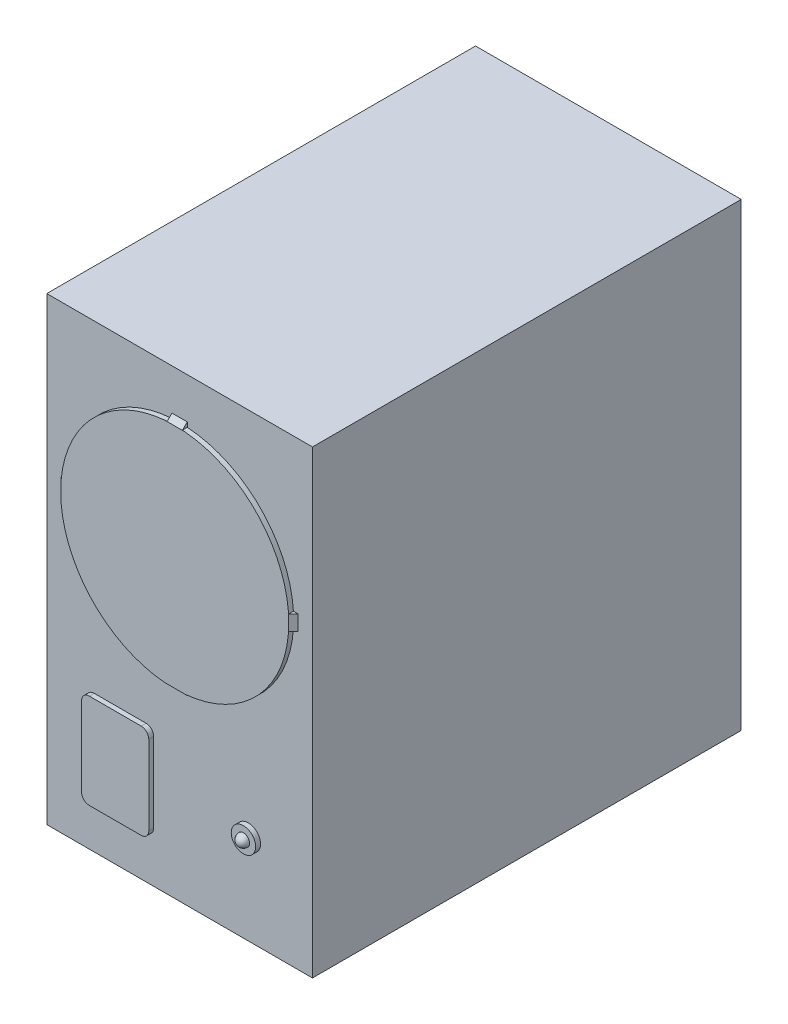
ISO-10303-21;
HEADER;
FILE_DESCRIPTION(('STEP AP214'),'2;1');
FILE_NAME('part.step','',(''),(''),'','','');
FILE_SCHEMA(('AUTOMOTIVE_DESIGN { 1 0 10303 214 1 1 1 1 }'));
ENDSEC;
DATA;
#1=APPLICATION_CONTEXT('core data for automotive mechanical design processes');
#2=APPLICATION_PROTOCOL_DEFINITION('international standard','automotive_design',2000,#1);
#3=PRODUCT_CONTEXT('',#1,'mechanical');
#4=PRODUCT('Part','Part','',(#3));
#5=PRODUCT_RELATED_PRODUCT_CATEGORY('part','',(#4));
#6=PRODUCT_DEFINITION_FORMATION('','',#4);
#7=PRODUCT_DEFINITION_CONTEXT('part definition',#1,'design');
#8=PRODUCT_DEFINITION('design','',#6,#7);
#9=PRODUCT_DEFINITION_SHAPE('','',#8);
#10=(LENGTH_UNIT() NAMED_UNIT(*) SI_UNIT(.MILLI.,.METRE.));
#11=(NAMED_UNIT(*) PLANE_ANGLE_UNIT() SI_UNIT($,.RADIAN.));
#12=(NAMED_UNIT(*) SI_UNIT($,.STERADIAN.) SOLID_ANGLE_UNIT());
#13=UNCERTAINTY_MEASURE_WITH_UNIT(LENGTH_MEASURE(1.E-05),#10,'distance_accuracy_value','');
#14=(GEOMETRIC_REPRESENTATION_CONTEXT(3) GLOBAL_UNCERTAINTY_ASSIGNED_CONTEXT((#13)) GLOBAL_UNIT_ASSIGNED_CONTEXT((#10,
#11,#12)) REPRESENTATION_CONTEXT('',''));
#15=CARTESIAN_POINT('',(0.,0.,0.));
#16=DIRECTION('',(0.,0.,1.));
#17=DIRECTION('',(1.,0.,0.));
#18=AXIS2_PLACEMENT_3D('',#15,#16,#17);
#19=CARTESIAN_POINT('',(-43.5,150.6,-70.2));
#20=DIRECTION('',(0.,0.,1.));
#21=DIRECTION('',(1.,0.,0.));
#22=AXIS2_PLACEMENT_3D('',#19,#20,#21);
#23=PLANE('',#22);
#24=CARTESIAN_POINT('',(0.,15.,-70.2));
#25=DIRECTION('',(0.,0.,-1.));
#26=DIRECTION('',(-1.,0.,0.));
#27=AXIS2_PLACEMENT_3D('',#24,#25,#26);
#28=CIRCLE('',#27,8.);
#29=CARTESIAN_POINT('',(-8.,15.,-70.2));
#30=VERTEX_POINT('',#29);
#31=CARTESIAN_POINT('',(8.,15.,-70.2));
#32=VERTEX_POINT('',#31);
#33=EDGE_CURVE('E64',#30,#32,#28,.T.);
#34=ORIENTED_EDGE('',*,*,#33,.F.);
#35=DIRECTION('',(0.,-1.,0.));
#36=VECTOR('',#35,1.);
#37=CARTESIAN_POINT('',(-8.,0.,-70.2));
#38=LINE('',#37,#36);
#39=CARTESIAN_POINT('',(-8.,0.,-70.2));
#40=VERTEX_POINT('',#39);
#41=EDGE_CURVE('E69',#30,#40,#38,.T.);
#42=ORIENTED_EDGE('',*,*,#41,.T.);
#43=DIRECTION('',(-1.,0.,0.));
#44=VECTOR('',#43,1.);
#45=CARTESIAN_POINT('',(-43.5,0.,-70.2));
#46=LINE('',#45,#44);
#47=CARTESIAN_POINT('',(-43.5,0.,-70.2));
#48=VERTEX_POINT('',#47);
#49=EDGE_CURVE('E511',#40,#48,#46,.T.);
#50=ORIENTED_EDGE('',*,*,#49,.T.);
#51=DIRECTION('',(0.,-1.,0.));
#52=VECTOR('',#51,1.);
#53=CARTESIAN_POINT('',(-43.5,150.6,-70.2));
#54=LINE('',#53,#52);
#55=CARTESIAN_POINT('',(-43.5,150.6,-70.2));
#56=VERTEX_POINT('',#55);
#57=EDGE_CURVE('E501',#56,#48,#54,.T.);
#58=ORIENTED_EDGE('',*,*,#57,.F.);
#59=DIRECTION('',(-1.,0.,0.));
#60=VECTOR('',#59,1.);
#61=CARTESIAN_POINT('',(-43.5,150.6,-70.2));
#62=LINE('',#61,#60);
#63=CARTESIAN_POINT('',(43.5,150.6,-70.2));
#64=VERTEX_POINT('',#63);
#65=EDGE_CURVE('E498',#64,#56,#62,.T.);
#66=ORIENTED_EDGE('',*,*,#65,.F.);
#67=DIRECTION('',(0.,-1.,0.));
#68=VECTOR('',#67,1.);
#69=CARTESIAN_POINT('',(43.5,150.6,-70.2));
#70=LINE('',#69,#68);
#71=CARTESIAN_POINT('',(43.5,0.,-70.2));
#72=VERTEX_POINT('',#71);
#73=EDGE_CURVE('E517',#64,#72,#70,.T.);
#74=ORIENTED_EDGE('',*,*,#73,.T.);
#75=CARTESIAN_POINT('',(8.,0.,-70.2));
#76=VERTEX_POINT('',#75);
#77=EDGE_CURVE('E492',#72,#76,#46,.T.);
#78=ORIENTED_EDGE('',*,*,#77,.T.);
#79=DIRECTION('',(0.,-1.,0.));
#80=VECTOR('',#79,1.);
#81=CARTESIAN_POINT('',(8.,0.,-70.2));
#82=LINE('',#81,#80);
#83=EDGE_CURVE('E280',#32,#76,#82,.T.);
#84=ORIENTED_EDGE('',*,*,#83,.F.);
#85=EDGE_LOOP('',(#34,#42,#50,#58,#66,#74,#78,#84));
#86=FACE_BOUND('',#85,.T.);
#87=ADVANCED_FACE('F47',(#86),#23,.F.);
#88=CARTESIAN_POINT('',(-43.5,150.6,70.2));
#89=DIRECTION('',(0.,0.,-1.));
#90=DIRECTION('',(-1.,0.,0.));
#91=AXIS2_PLACEMENT_3D('',#88,#89,#90);
#92=PLANE('',#91);
#93=CARTESIAN_POINT('',(22.5,29.5,70.2));
#94=DIRECTION('',(0.,0.,-1.));
#95=DIRECTION('',(-1.,0.,0.));
#96=AXIS2_PLACEMENT_3D('',#93,#94,#95);
#97=CIRCLE('',#96,4.);
#98=CARTESIAN_POINT('',(18.5,29.5,70.2));
#99=VERTEX_POINT('',#98);
#100=EDGE_CURVE('E529',#99,#99,#97,.F.);
#101=ORIENTED_EDGE('',*,*,#100,.F.);
#102=EDGE_LOOP('',(#101));
#103=FACE_BOUND('',#102,.T.);
#104=DIRECTION('',(1.,0.,0.));
#105=VECTOR('',#104,1.);
#106=CARTESIAN_POINT('',(0.,14.,70.2));
#107=LINE('',#106,#105);
#108=CARTESIAN_POINT('',(-28.,14.,70.2));
#109=VERTEX_POINT('',#108);
#110=CARTESIAN_POINT('',(-11.,14.,70.2));
#111=VERTEX_POINT('',#110);
#112=EDGE_CURVE('E343',#109,#111,#107,.T.);
#113=ORIENTED_EDGE('',*,*,#112,.F.);
#114=CARTESIAN_POINT('',(-28.,16.5,70.2));
#115=DIRECTION('',(0.,0.,1.));
#116=DIRECTION('',(1.,0.,0.));
#117=AXIS2_PLACEMENT_3D('',#114,#115,#116);
#118=CIRCLE('',#117,2.5);
#119=CARTESIAN_POINT('',(-30.5,16.5,70.2));
#120=VERTEX_POINT('',#119);
#121=EDGE_CURVE('E310',#109,#120,#118,.F.);
#122=ORIENTED_EDGE('',*,*,#121,.T.);
#123=DIRECTION('',(0.,-1.,0.));
#124=VECTOR('',#123,1.);
#125=CARTESIAN_POINT('',(-30.5,0.,70.2));
#126=LINE('',#125,#124);
#127=CARTESIAN_POINT('',(-30.5,42.5,70.2));
#128=VERTEX_POINT('',#127);
#129=EDGE_CURVE('E316',#128,#120,#126,.T.);
#130=ORIENTED_EDGE('',*,*,#129,.F.);
#131=CARTESIAN_POINT('',(-28.,42.5,70.2));
#132=DIRECTION('',(0.,0.,1.));
#133=DIRECTION('',(1.,0.,0.));
#134=AXIS2_PLACEMENT_3D('',#131,#132,#133);
#135=CIRCLE('',#134,2.5);
#136=CARTESIAN_POINT('',(-28.,45.,70.2));
#137=VERTEX_POINT('',#136);
#138=EDGE_CURVE('E360',#137,#128,#135,.T.);
#139=ORIENTED_EDGE('',*,*,#138,.F.);
#140=DIRECTION('',(1.,0.,0.));
#141=VECTOR('',#140,1.);
#142=CARTESIAN_POINT('',(0.,45.,70.2));
#143=LINE('',#142,#141);
#144=CARTESIAN_POINT('',(-11.,45.,70.2));
#145=VERTEX_POINT('',#144);
#146=EDGE_CURVE('E357',#137,#145,#143,.T.);
#147=ORIENTED_EDGE('',*,*,#146,.T.);
#148=CARTESIAN_POINT('',(-11.,42.5,70.2));
#149=DIRECTION('',(0.,0.,1.));
#150=DIRECTION('',(1.,0.,0.));
#151=AXIS2_PLACEMENT_3D('',#148,#149,#150);
#152=CIRCLE('',#151,2.5);
#153=CARTESIAN_POINT('',(-8.49999999999999,42.5,70.2));
#154=VERTEX_POINT('',#153);
#155=EDGE_CURVE('E354',#145,#154,#152,.F.);
#156=ORIENTED_EDGE('',*,*,#155,.T.);
#157=DIRECTION('',(0.,-1.,0.));
#158=VECTOR('',#157,1.);
#159=CARTESIAN_POINT('',(-8.49999999999999,0.,70.2));
#160=LINE('',#159,#158);
#161=CARTESIAN_POINT('',(-8.49999999999999,16.5,70.2));
#162=VERTEX_POINT('',#161);
#163=EDGE_CURVE('E351',#154,#162,#160,.T.);
#164=ORIENTED_EDGE('',*,*,#163,.T.);
#165=CARTESIAN_POINT('',(-11.,16.5,70.2));
#166=DIRECTION('',(0.,0.,1.));
#167=DIRECTION('',(1.,0.,0.));
#168=AXIS2_PLACEMENT_3D('',#165,#166,#167);
#169=CIRCLE('',#168,2.5);
#170=EDGE_CURVE('E347',#111,#162,#169,.T.);
#171=ORIENTED_EDGE('',*,*,#170,.F.);
#172=EDGE_LOOP('',(#113,#122,#130,#139,#147,#156,#164,#171));
#173=FACE_BOUND('',#172,.T.);
#174=DIRECTION('',(1.,0.,0.));
#175=VECTOR('',#174,1.);
#176=CARTESIAN_POINT('',(-43.5,0.,70.2));
#177=LINE('',#176,#175);
#178=CARTESIAN_POINT('',(-43.5,0.,70.2));
#179=VERTEX_POINT('',#178);
#180=CARTESIAN_POINT('',(43.5,0.,70.2));
#181=VERTEX_POINT('',#180);
#182=EDGE_CURVE('E505',#179,#181,#177,.T.);
#183=ORIENTED_EDGE('',*,*,#182,.T.);
#184=DIRECTION('',(0.,-1.,0.));
#185=VECTOR('',#184,1.);
#186=CARTESIAN_POINT('',(43.5,150.6,70.2));
#187=LINE('',#186,#185);
#188=CARTESIAN_POINT('',(43.5,150.6,70.2));
#189=VERTEX_POINT('',#188);
#190=EDGE_CURVE('E521',#189,#181,#187,.T.);
#191=ORIENTED_EDGE('',*,*,#190,.F.);
#192=DIRECTION('',(1.,0.,0.));
#193=VECTOR('',#192,1.);
#194=CARTESIAN_POINT('',(-43.5,150.6,70.2));
#195=LINE('',#194,#193);
#196=CARTESIAN_POINT('',(-43.5,150.6,70.2));
#197=VERTEX_POINT('',#196);
#198=EDGE_CURVE('E491',#197,#189,#195,.T.);
#199=ORIENTED_EDGE('',*,*,#198,.F.);
#200=DIRECTION('',(0.,-1.,0.));
#201=VECTOR('',#200,1.);
#202=CARTESIAN_POINT('',(-43.5,150.6,70.2));
#203=LINE('',#202,#201);
#204=EDGE_CURVE('E525',#197,#179,#203,.T.);
#205=ORIENTED_EDGE('',*,*,#204,.T.);
#206=EDGE_LOOP('',(#183,#191,#199,#205));
#207=FACE_BOUND('',#206,.T.);
#208=CARTESIAN_POINT('',(0.,98.4,70.2));
#209=DIRECTION('',(0.,0.,1.));
#210=DIRECTION('',(1.,0.,0.));
#211=AXIS2_PLACEMENT_3D('',#208,#209,#210);
#212=CIRCLE('',#211,37.35);
#213=CARTESIAN_POINT('',(-2.5,135.666238071477,70.2));
#214=VERTEX_POINT('',#213);
#215=CARTESIAN_POINT('',(-37.266238071477,100.9,70.2));
#216=VERTEX_POINT('',#215);
#217=EDGE_CURVE('E398',#214,#216,#212,.T.);
#218=ORIENTED_EDGE('',*,*,#217,.F.);
#219=DIRECTION('',(0.,-1.,0.));
#220=VECTOR('',#219,1.);
#221=CARTESIAN_POINT('',(-2.5,0.,70.2));
#222=LINE('',#221,#220);
#223=CARTESIAN_POINT('',(-2.5,137.2,70.2));
#224=VERTEX_POINT('',#223);
#225=EDGE_CURVE('E404',#224,#214,#222,.T.);
#226=ORIENTED_EDGE('',*,*,#225,.F.);
#227=DIRECTION('',(-1.,0.,0.));
#228=VECTOR('',#227,1.);
#229=CARTESIAN_POINT('',(-43.5,137.2,70.2));
#230=LINE('',#229,#228);
#231=CARTESIAN_POINT('',(2.5,137.2,70.2));
#232=VERTEX_POINT('',#231);
#233=EDGE_CURVE('E57',#224,#232,#230,.F.);
#234=ORIENTED_EDGE('',*,*,#233,.T.);
#235=DIRECTION('',(0.,-1.,0.));
#236=VECTOR('',#235,1.);
#237=CARTESIAN_POINT('',(2.49999999999995,0.,70.2));
#238=LINE('',#237,#236);
#239=CARTESIAN_POINT('',(2.5,135.666238071477,70.2));
#240=VERTEX_POINT('',#239);
#241=EDGE_CURVE('E452',#232,#240,#238,.T.);
#242=ORIENTED_EDGE('',*,*,#241,.T.);
#243=CARTESIAN_POINT('',(0.,98.4,70.2));
#244=DIRECTION('',(0.,0.,1.));
#245=DIRECTION('',(1.,0.,0.));
#246=AXIS2_PLACEMENT_3D('',#243,#244,#245);
#247=CIRCLE('',#246,37.35);
#248=CARTESIAN_POINT('',(37.266238071477,100.9,70.2));
#249=VERTEX_POINT('',#248);
#250=EDGE_CURVE('E448',#249,#240,#247,.T.);
#251=ORIENTED_EDGE('',*,*,#250,.F.);
#252=DIRECTION('',(-1.,0.,0.));
#253=VECTOR('',#252,1.);
#254=CARTESIAN_POINT('',(0.,100.9,70.2));
#255=LINE('',#254,#253);
#256=CARTESIAN_POINT('',(38.8,100.9,70.2));
#257=VERTEX_POINT('',#256);
#258=EDGE_CURVE('E445',#257,#249,#255,.T.);
#259=ORIENTED_EDGE('',*,*,#258,.F.);
#260=DIRECTION('',(0.,1.,0.));
#261=VECTOR('',#260,1.);
#262=CARTESIAN_POINT('',(38.8,150.6,70.2));
#263=LINE('',#262,#261);
#264=CARTESIAN_POINT('',(38.8,95.9,70.2));
#265=VERTEX_POINT('',#264);
#266=EDGE_CURVE('E11',#257,#265,#263,.F.);
#267=ORIENTED_EDGE('',*,*,#266,.T.);
#268=DIRECTION('',(-1.,0.,0.));
#269=VECTOR('',#268,1.);
#270=CARTESIAN_POINT('',(0.,95.9,70.2));
#271=LINE('',#270,#269);
#272=CARTESIAN_POINT('',(37.266238071477,95.9,70.2));
#273=VERTEX_POINT('',#272);
#274=EDGE_CURVE('E442',#265,#273,#271,.T.);
#275=ORIENTED_EDGE('',*,*,#274,.T.);
#276=CARTESIAN_POINT('',(0.,98.4,70.2));
#277=DIRECTION('',(0.,0.,1.));
#278=DIRECTION('',(1.,0.,0.));
#279=AXIS2_PLACEMENT_3D('',#276,#277,#278);
#280=CIRCLE('',#279,37.35);
#281=CARTESIAN_POINT('',(2.5,61.133761928523,70.2));
#282=VERTEX_POINT('',#281);
#283=EDGE_CURVE('E438',#282,#273,#280,.T.);
#284=ORIENTED_EDGE('',*,*,#283,.F.);
#285=DIRECTION('',(0.,1.,0.));
#286=VECTOR('',#285,1.);
#287=CARTESIAN_POINT('',(2.50000000000001,0.,70.2));
#288=LINE('',#287,#286);
#289=CARTESIAN_POINT('',(2.5,59.6,70.2));
#290=VERTEX_POINT('',#289);
#291=EDGE_CURVE('E435',#290,#282,#288,.T.);
#292=ORIENTED_EDGE('',*,*,#291,.F.);
#293=DIRECTION('',(-1.,0.,0.));
#294=VECTOR('',#293,1.);
#295=CARTESIAN_POINT('',(-43.5,59.6,70.2));
#296=LINE('',#295,#294);
#297=CARTESIAN_POINT('',(-2.49999999999998,59.6,70.2));
#298=VERTEX_POINT('',#297);
#299=EDGE_CURVE('E597',#290,#298,#296,.T.);
#300=ORIENTED_EDGE('',*,*,#299,.T.);
#301=DIRECTION('',(0.,1.,0.));
#302=VECTOR('',#301,1.);
#303=CARTESIAN_POINT('',(-2.49999999999997,0.,70.2));
#304=LINE('',#303,#302);
#305=CARTESIAN_POINT('',(-2.49999999999998,61.133761928523,70.2));
#306=VERTEX_POINT('',#305);
#307=EDGE_CURVE('E431',#298,#306,#304,.T.);
#308=ORIENTED_EDGE('',*,*,#307,.T.);
#309=CARTESIAN_POINT('',(0.,98.4,70.2));
#310=DIRECTION('',(0.,0.,1.));
#311=DIRECTION('',(1.,0.,0.));
#312=AXIS2_PLACEMENT_3D('',#309,#310,#311);
#313=CIRCLE('',#312,37.35);
#314=CARTESIAN_POINT('',(-37.266238071477,95.9,70.2));
#315=VERTEX_POINT('',#314);
#316=EDGE_CURVE('E427',#315,#306,#313,.T.);
#317=ORIENTED_EDGE('',*,*,#316,.F.);
#318=DIRECTION('',(1.,0.,0.));
#319=VECTOR('',#318,1.);
#320=CARTESIAN_POINT('',(0.,95.9,70.2));
#321=LINE('',#320,#319);
#322=CARTESIAN_POINT('',(-38.8,95.9,70.2));
#323=VERTEX_POINT('',#322);
#324=EDGE_CURVE('E424',#323,#315,#321,.T.);
#325=ORIENTED_EDGE('',*,*,#324,.F.);
#326=DIRECTION('',(0.,1.,0.));
#327=VECTOR('',#326,1.);
#328=CARTESIAN_POINT('',(-38.8,150.6,70.2));
#329=LINE('',#328,#327);
#330=CARTESIAN_POINT('',(-38.8,100.9,70.2));
#331=VERTEX_POINT('',#330);
#332=EDGE_CURVE('E600',#323,#331,#329,.T.);
#333=ORIENTED_EDGE('',*,*,#332,.T.);
#334=DIRECTION('',(1.,0.,0.));
#335=VECTOR('',#334,1.);
#336=CARTESIAN_POINT('',(0.,100.9,70.2));
#337=LINE('',#336,#335);
#338=EDGE_CURVE('E420',#331,#216,#337,.T.);
#339=ORIENTED_EDGE('',*,*,#338,.T.);
#340=EDGE_LOOP('',(#218,#226,#234,#242,#251,#259,#267,#275,#284,#292,#300,#308,#317,#325,#333,#339));
#341=FACE_BOUND('',#340,.T.);
#342=ADVANCED_FACE('F608',(#103,#173,#207,#341),#92,.F.);
#343=CARTESIAN_POINT('',(-43.5,150.6,-70.2));
#344=DIRECTION('',(1.,0.,0.));
#345=DIRECTION('',(0.,0.,-1.));
#346=AXIS2_PLACEMENT_3D('',#343,#344,#345);
#347=PLANE('',#346);
#348=DIRECTION('',(0.,0.,1.));
#349=VECTOR('',#348,1.);
#350=CARTESIAN_POINT('',(-43.5,0.,-70.2));
#351=LINE('',#350,#349);
#352=EDGE_CURVE('E486',#48,#179,#351,.T.);
#353=ORIENTED_EDGE('',*,*,#352,.T.);
#354=ORIENTED_EDGE('',*,*,#204,.F.);
#355=DIRECTION('',(0.,0.,1.));
#356=VECTOR('',#355,1.);
#357=CARTESIAN_POINT('',(-43.5,150.6,-70.2));
#358=LINE('',#357,#356);
#359=EDGE_CURVE('E487',#56,#197,#358,.T.);
#360=ORIENTED_EDGE('',*,*,#359,.F.);
#361=ORIENTED_EDGE('',*,*,#57,.T.);
#362=EDGE_LOOP('',(#353,#354,#360,#361));
#363=FACE_BOUND('',#362,.T.);
#364=ADVANCED_FACE('F694',(#363),#347,.F.);
#365=CARTESIAN_POINT('',(43.5,150.6,-70.2));
#366=DIRECTION('',(-1.,0.,0.));
#367=DIRECTION('',(0.,0.,1.));
#368=AXIS2_PLACEMENT_3D('',#365,#366,#367);
#369=PLANE('',#368);
#370=DIRECTION('',(0.,0.,-1.));
#371=VECTOR('',#370,1.);
#372=CARTESIAN_POINT('',(43.5,0.,-70.2));
#373=LINE('',#372,#371);
#374=EDGE_CURVE('E508',#181,#72,#373,.T.);
#375=ORIENTED_EDGE('',*,*,#374,.T.);
#376=ORIENTED_EDGE('',*,*,#73,.F.);
#377=DIRECTION('',(0.,0.,-1.));
#378=VECTOR('',#377,1.);
#379=CARTESIAN_POINT('',(43.5,150.6,-70.2));
#380=LINE('',#379,#378);
#381=EDGE_CURVE('E495',#189,#64,#380,.T.);
#382=ORIENTED_EDGE('',*,*,#381,.F.);
#383=ORIENTED_EDGE('',*,*,#190,.T.);
#384=EDGE_LOOP('',(#375,#376,#382,#383));
#385=FACE_BOUND('',#384,.T.);
#386=ADVANCED_FACE('F701',(#385),#369,.F.);
#387=CARTESIAN_POINT('',(0.,150.6,0.));
#388=DIRECTION('',(0.,1.,0.));
#389=DIRECTION('',(0.,0.,1.));
#390=AXIS2_PLACEMENT_3D('',#387,#388,#389);
#391=PLANE('',#390);
#392=ORIENTED_EDGE('',*,*,#359,.T.);
#393=ORIENTED_EDGE('',*,*,#198,.T.);
#394=ORIENTED_EDGE('',*,*,#381,.T.);
#395=ORIENTED_EDGE('',*,*,#65,.T.);
#396=EDGE_LOOP('',(#392,#393,#394,#395));
#397=FACE_BOUND('',#396,.T.);
#398=ADVANCED_FACE('F703',(#397),#391,.T.);
#399=CARTESIAN_POINT('',(0.,0.,0.));
#400=DIRECTION('',(0.,1.,0.));
#401=DIRECTION('',(0.,0.,1.));
#402=AXIS2_PLACEMENT_3D('',#399,#400,#401);
#403=PLANE('',#402);
#404=ORIENTED_EDGE('',*,*,#352,.F.);
#405=ORIENTED_EDGE('',*,*,#49,.F.);
#406=DIRECTION('',(0.,0.,1.));
#407=VECTOR('',#406,1.);
#408=CARTESIAN_POINT('',(-8.,0.,-75.2));
#409=LINE('',#408,#407);
#410=CARTESIAN_POINT('',(-8.,0.,-75.2));
#411=VERTEX_POINT('',#410);
#412=EDGE_CURVE('E290',#411,#40,#409,.T.);
#413=ORIENTED_EDGE('',*,*,#412,.F.);
#414=DIRECTION('',(-1.,0.,0.));
#415=VECTOR('',#414,1.);
#416=CARTESIAN_POINT('',(0.,0.,-75.2));
#417=LINE('',#416,#415);
#418=CARTESIAN_POINT('',(8.,0.,-75.2));
#419=VERTEX_POINT('',#418);
#420=EDGE_CURVE('E277',#419,#411,#417,.T.);
#421=ORIENTED_EDGE('',*,*,#420,.F.);
#422=DIRECTION('',(0.,0.,1.));
#423=VECTOR('',#422,1.);
#424=CARTESIAN_POINT('',(8.,0.,-75.2));
#425=LINE('',#424,#423);
#426=EDGE_CURVE('E297',#419,#76,#425,.T.);
#427=ORIENTED_EDGE('',*,*,#426,.T.);
#428=ORIENTED_EDGE('',*,*,#77,.F.);
#429=ORIENTED_EDGE('',*,*,#374,.F.);
#430=ORIENTED_EDGE('',*,*,#182,.F.);
#431=EDGE_LOOP('',(#404,#405,#413,#421,#427,#428,#429,#430));
#432=FACE_BOUND('',#431,.T.);
#433=ADVANCED_FACE('F699',(#432),#403,.F.);
#434=CARTESIAN_POINT('',(0.,98.4,71.8));
#435=DIRECTION('',(0.,0.,-1.));
#436=DIRECTION('',(-1.,0.,0.));
#437=AXIS2_PLACEMENT_3D('',#434,#435,#436);
#438=CYLINDRICAL_SURFACE('',#437,37.35);
#439=DIRECTION('',(0.,0.,-1.));
#440=VECTOR('',#439,1.);
#441=CARTESIAN_POINT('',(-37.266238071477,100.9,71.8));
#442=LINE('',#441,#440);
#443=CARTESIAN_POINT('',(-37.266238071477,100.9,71.733761928523));
#444=VERTEX_POINT('',#443);
#445=EDGE_CURVE('E483',#444,#216,#442,.T.);
#446=ORIENTED_EDGE('',*,*,#445,.F.);
#447=CARTESIAN_POINT('',(0.,98.4,109.));
#448=DIRECTION('',(-0.707106781186544,0.,0.707106781186551));
#449=DIRECTION('',(-0.707106781186551,0.,-0.707106781186544));
#450=AXIS2_PLACEMENT_3D('',#447,#448,#449);
#451=ELLIPSE('',#450,52.8208765546348,37.35);
#452=CARTESIAN_POINT('',(-37.2,101.744024521442,71.8));
#453=VERTEX_POINT('',#452);
#454=EDGE_CURVE('E576',#444,#453,#451,.F.);
#455=ORIENTED_EDGE('',*,*,#454,.T.);
#456=CARTESIAN_POINT('',(0.,98.4,71.8));
#457=DIRECTION('',(0.,0.,1.));
#458=DIRECTION('',(1.,0.,0.));
#459=AXIS2_PLACEMENT_3D('',#456,#457,#458);
#460=CIRCLE('',#459,37.35);
#461=CARTESIAN_POINT('',(-3.34402452144164,135.6,71.8));
#462=VERTEX_POINT('',#461);
#463=EDGE_CURVE('E399',#462,#453,#460,.T.);
#464=ORIENTED_EDGE('',*,*,#463,.F.);
#465=CARTESIAN_POINT('',(0.,98.4,109.));
#466=DIRECTION('',(0.,-0.707106781186549,-0.707106781186545));
#467=DIRECTION('',(0.,0.707106781186546,-0.70710678118655));
#468=AXIS2_PLACEMENT_3D('',#465,#466,#467);
#469=ELLIPSE('',#468,52.8208765546352,37.35);
#470=CARTESIAN_POINT('',(-2.5,135.666238071477,71.733761928523));
#471=VERTEX_POINT('',#470);
#472=EDGE_CURVE('E573',#462,#471,#469,.T.);
#473=ORIENTED_EDGE('',*,*,#472,.T.);
#474=DIRECTION('',(0.,0.,-1.));
#475=VECTOR('',#474,1.);
#476=CARTESIAN_POINT('',(-2.5,135.666238071477,71.8));
#477=LINE('',#476,#475);
#478=EDGE_CURVE('E416',#471,#214,#477,.T.);
#479=ORIENTED_EDGE('',*,*,#478,.T.);
#480=ORIENTED_EDGE('',*,*,#217,.T.);
#481=EDGE_LOOP('',(#446,#455,#464,#473,#479,#480));
#482=FACE_BOUND('',#481,.T.);
#483=ADVANCED_FACE('F676',(#482),#438,.T.);
#484=CARTESIAN_POINT('',(0.,100.9,71.8));
#485=DIRECTION('',(0.,1.,0.));
#486=DIRECTION('',(0.,0.,1.));
#487=AXIS2_PLACEMENT_3D('',#484,#485,#486);
#488=PLANE('',#487);
#489=ORIENTED_EDGE('',*,*,#338,.F.);
#490=DIRECTION('',(0.707106781186551,0.,0.707106781186544));
#491=VECTOR('',#490,1.);
#492=CARTESIAN_POINT('',(-18.5999999999998,100.9,90.4));
#493=LINE('',#492,#491);
#494=EDGE_CURVE('E570',#331,#444,#493,.T.);
#495=ORIENTED_EDGE('',*,*,#494,.T.);
#496=ORIENTED_EDGE('',*,*,#445,.T.);
#497=EDGE_LOOP('',(#489,#495,#496));
#498=FACE_BOUND('',#497,.T.);
#499=ADVANCED_FACE('F674',(#498),#488,.T.);
#500=CARTESIAN_POINT('',(0.,95.9,71.8));
#501=DIRECTION('',(0.,1.,0.));
#502=DIRECTION('',(0.,0.,1.));
#503=AXIS2_PLACEMENT_3D('',#500,#501,#502);
#504=PLANE('',#503);
#505=DIRECTION('',(0.,0.,-1.));
#506=VECTOR('',#505,1.);
#507=CARTESIAN_POINT('',(-37.266238071477,95.9,71.8));
#508=LINE('',#507,#506);
#509=CARTESIAN_POINT('',(-37.266238071477,95.9,71.733761928523));
#510=VERTEX_POINT('',#509);
#511=EDGE_CURVE('E479',#510,#315,#508,.T.);
#512=ORIENTED_EDGE('',*,*,#511,.F.);
#513=DIRECTION('',(-0.707106781186551,0.,-0.707106781186544));
#514=VECTOR('',#513,1.);
#515=CARTESIAN_POINT('',(-37.2,95.9,71.8));
#516=LINE('',#515,#514);
#517=EDGE_CURVE('E567',#510,#323,#516,.T.);
#518=ORIENTED_EDGE('',*,*,#517,.T.);
#519=ORIENTED_EDGE('',*,*,#324,.T.);
#520=EDGE_LOOP('',(#512,#518,#519));
#521=FACE_BOUND('',#520,.T.);
#522=ADVANCED_FACE('F826',(#521),#504,.F.);
#523=CARTESIAN_POINT('',(0.,98.4,71.8));
#524=DIRECTION('',(0.,0.,-1.));
#525=DIRECTION('',(-1.,0.,0.));
#526=AXIS2_PLACEMENT_3D('',#523,#524,#525);
#527=CYLINDRICAL_SURFACE('',#526,37.35);
#528=DIRECTION('',(0.,0.,-1.));
#529=VECTOR('',#528,1.);
#530=CARTESIAN_POINT('',(-2.49999999999998,61.133761928523,71.8));
#531=LINE('',#530,#529);
#532=CARTESIAN_POINT('',(-2.49999999999998,61.133761928523,71.733761928523));
#533=VERTEX_POINT('',#532);
#534=EDGE_CURVE('E476',#533,#306,#531,.T.);
#535=ORIENTED_EDGE('',*,*,#534,.F.);
#536=CARTESIAN_POINT('',(0.,98.4,109.));
#537=DIRECTION('',(0.,-0.707106781186544,0.707106781186551));
#538=DIRECTION('',(0.,-0.707106781186551,-0.707106781186544));
#539=AXIS2_PLACEMENT_3D('',#536,#537,#538);
#540=ELLIPSE('',#539,52.8208765546348,37.35);
#541=CARTESIAN_POINT('',(-3.3440245214418,61.2,71.8));
#542=VERTEX_POINT('',#541);
#543=EDGE_CURVE('E564',#533,#542,#540,.F.);
#544=ORIENTED_EDGE('',*,*,#543,.T.);
#545=CARTESIAN_POINT('',(0.,98.4,71.8));
#546=DIRECTION('',(0.,0.,1.));
#547=DIRECTION('',(1.,0.,0.));
#548=AXIS2_PLACEMENT_3D('',#545,#546,#547);
#549=CIRCLE('',#548,37.35);
#550=CARTESIAN_POINT('',(-37.2,95.0559754785584,71.8));
#551=VERTEX_POINT('',#550);
#552=EDGE_CURVE('E403',#551,#542,#549,.T.);
#553=ORIENTED_EDGE('',*,*,#552,.F.);
#554=CARTESIAN_POINT('',(0.,98.4,109.));
#555=DIRECTION('',(-0.707106781186544,0.,0.707106781186551));
#556=DIRECTION('',(-0.707106781186551,0.,-0.707106781186544));
#557=AXIS2_PLACEMENT_3D('',#554,#555,#556);
#558=ELLIPSE('',#557,52.8208765546348,37.35);
#559=EDGE_CURVE('E561',#551,#510,#558,.F.);
#560=ORIENTED_EDGE('',*,*,#559,.T.);
#561=ORIENTED_EDGE('',*,*,#511,.T.);
#562=ORIENTED_EDGE('',*,*,#316,.T.);
#563=EDGE_LOOP('',(#535,#544,#553,#560,#561,#562));
#564=FACE_BOUND('',#563,.T.);
#565=ADVANCED_FACE('F658',(#564),#527,.T.);
#566=CARTESIAN_POINT('',(-2.49999999999997,0.,71.8));
#567=DIRECTION('',(-1.,0.,0.));
#568=DIRECTION('',(0.,-1.,0.));
#569=AXIS2_PLACEMENT_3D('',#566,#567,#568);
#570=PLANE('',#569);
#571=ORIENTED_EDGE('',*,*,#307,.F.);
#572=DIRECTION('',(0.,0.707106781186551,0.707106781186544));
#573=VECTOR('',#572,1.);
#574=CARTESIAN_POINT('',(-2.49999999999998,30.5999999999997,41.2));
#575=LINE('',#574,#573);
#576=EDGE_CURVE('E558',#298,#533,#575,.T.);
#577=ORIENTED_EDGE('',*,*,#576,.T.);
#578=ORIENTED_EDGE('',*,*,#534,.T.);
#579=EDGE_LOOP('',(#571,#577,#578));
#580=FACE_BOUND('',#579,.T.);
#581=ADVANCED_FACE('F656',(#580),#570,.T.);
#582=CARTESIAN_POINT('',(2.50000000000001,0.,71.8));
#583=DIRECTION('',(-1.,0.,0.));
#584=DIRECTION('',(0.,-1.,0.));
#585=AXIS2_PLACEMENT_3D('',#582,#583,#584);
#586=PLANE('',#585);
#587=DIRECTION('',(0.,0.,-1.));
#588=VECTOR('',#587,1.);
#589=CARTESIAN_POINT('',(2.5,61.133761928523,71.8));
#590=LINE('',#589,#588);
#591=CARTESIAN_POINT('',(2.5,61.133761928523,71.733761928523));
#592=VERTEX_POINT('',#591);
#593=EDGE_CURVE('E472',#592,#282,#590,.T.);
#594=ORIENTED_EDGE('',*,*,#593,.F.);
#595=DIRECTION('',(0.,-0.707106781186551,-0.707106781186544));
#596=VECTOR('',#595,1.);
#597=CARTESIAN_POINT('',(2.5,61.2,71.8));
#598=LINE('',#597,#596);
#599=EDGE_CURVE('E555',#592,#290,#598,.T.);
#600=ORIENTED_EDGE('',*,*,#599,.T.);
#601=ORIENTED_EDGE('',*,*,#291,.T.);
#602=EDGE_LOOP('',(#594,#600,#601));
#603=FACE_BOUND('',#602,.T.);
#604=ADVANCED_FACE('F833',(#603),#586,.F.);
#605=CARTESIAN_POINT('',(0.,98.4,71.8));
#606=DIRECTION('',(0.,0.,-1.));
#607=DIRECTION('',(-1.,0.,0.));
#608=AXIS2_PLACEMENT_3D('',#605,#606,#607);
#609=CYLINDRICAL_SURFACE('',#608,37.35);
#610=CARTESIAN_POINT('',(0.,98.4,71.8));
#611=DIRECTION('',(0.,0.,1.));
#612=DIRECTION('',(1.,0.,0.));
#613=AXIS2_PLACEMENT_3D('',#610,#611,#612);
#614=CIRCLE('',#613,37.35);
#615=CARTESIAN_POINT('',(3.34402452144196,61.2,71.8));
#616=VERTEX_POINT('',#615);
#617=CARTESIAN_POINT('',(37.2,95.0559754785587,71.8));
#618=VERTEX_POINT('',#617);
#619=EDGE_CURVE('E408',#616,#618,#614,.T.);
#620=ORIENTED_EDGE('',*,*,#619,.F.);
#621=CARTESIAN_POINT('',(0.,98.4,109.));
#622=DIRECTION('',(0.,-0.707106781186544,0.707106781186551));
#623=DIRECTION('',(0.,-0.707106781186551,-0.707106781186544));
#624=AXIS2_PLACEMENT_3D('',#621,#622,#623);
#625=ELLIPSE('',#624,52.8208765546348,37.35);
#626=EDGE_CURVE('E552',#616,#592,#625,.F.);
#627=ORIENTED_EDGE('',*,*,#626,.T.);
#628=ORIENTED_EDGE('',*,*,#593,.T.);
#629=ORIENTED_EDGE('',*,*,#283,.T.);
#630=DIRECTION('',(0.,0.,-1.));
#631=VECTOR('',#630,1.);
#632=CARTESIAN_POINT('',(37.266238071477,95.9,71.8));
#633=LINE('',#632,#631);
#634=CARTESIAN_POINT('',(37.266238071477,95.9,71.733761928523));
#635=VERTEX_POINT('',#634);
#636=EDGE_CURVE('E468',#635,#273,#633,.T.);
#637=ORIENTED_EDGE('',*,*,#636,.F.);
#638=CARTESIAN_POINT('',(0.,98.4,109.));
#639=DIRECTION('',(-0.707106781186551,0.,-0.707106781186544));
#640=DIRECTION('',(0.707106781186544,0.,-0.707106781186551));
#641=AXIS2_PLACEMENT_3D('',#638,#639,#640);
#642=ELLIPSE('',#641,52.8208765546354,37.35);
#643=EDGE_CURVE('E549',#635,#618,#642,.T.);
#644=ORIENTED_EDGE('',*,*,#643,.T.);
#645=EDGE_LOOP('',(#620,#627,#628,#629,#637,#644));
#646=FACE_BOUND('',#645,.T.);
#647=ADVANCED_FACE('F641',(#646),#609,.T.);
#648=CARTESIAN_POINT('',(0.,95.9,71.8));
#649=DIRECTION('',(0.,-1.,0.));
#650=DIRECTION('',(0.,0.,-1.));
#651=AXIS2_PLACEMENT_3D('',#648,#649,#650);
#652=PLANE('',#651);
#653=ORIENTED_EDGE('',*,*,#274,.F.);
#654=DIRECTION('',(0.707106781186544,0.,-0.707106781186551));
#655=VECTOR('',#654,1.);
#656=CARTESIAN_POINT('',(18.6000000000002,95.9,90.4));
#657=LINE('',#656,#655);
#658=EDGE_CURVE('E591',#265,#635,#657,.F.);
#659=ORIENTED_EDGE('',*,*,#658,.T.);
#660=ORIENTED_EDGE('',*,*,#636,.T.);
#661=EDGE_LOOP('',(#653,#659,#660));
#662=FACE_BOUND('',#661,.T.);
#663=ADVANCED_FACE('F639',(#662),#652,.T.);
#664=CARTESIAN_POINT('',(0.,100.9,71.8));
#665=DIRECTION('',(0.,-1.,0.));
#666=DIRECTION('',(0.,0.,-1.));
#667=AXIS2_PLACEMENT_3D('',#664,#665,#666);
#668=PLANE('',#667);
#669=DIRECTION('',(0.,0.,-1.));
#670=VECTOR('',#669,1.);
#671=CARTESIAN_POINT('',(37.266238071477,100.9,71.8));
#672=LINE('',#671,#670);
#673=CARTESIAN_POINT('',(37.266238071477,100.9,71.733761928523));
#674=VERTEX_POINT('',#673);
#675=EDGE_CURVE('E464',#674,#249,#672,.T.);
#676=ORIENTED_EDGE('',*,*,#675,.F.);
#677=DIRECTION('',(-0.707106781186544,0.,0.707106781186551));
#678=VECTOR('',#677,1.);
#679=CARTESIAN_POINT('',(39.7,100.9,69.3));
#680=LINE('',#679,#678);
#681=EDGE_CURVE('E594',#674,#257,#680,.F.);
#682=ORIENTED_EDGE('',*,*,#681,.T.);
#683=ORIENTED_EDGE('',*,*,#258,.T.);
#684=EDGE_LOOP('',(#676,#682,#683));
#685=FACE_BOUND('',#684,.T.);
#686=ADVANCED_FACE('F634',(#685),#668,.F.);
#687=CARTESIAN_POINT('',(0.,98.4,71.8));
#688=DIRECTION('',(0.,0.,-1.));
#689=DIRECTION('',(-1.,0.,0.));
#690=AXIS2_PLACEMENT_3D('',#687,#688,#689);
#691=CYLINDRICAL_SURFACE('',#690,37.35);
#692=DIRECTION('',(0.,0.,-1.));
#693=VECTOR('',#692,1.);
#694=CARTESIAN_POINT('',(2.5,135.666238071477,71.8));
#695=LINE('',#694,#693);
#696=CARTESIAN_POINT('',(2.5,135.666238071477,71.733761928523));
#697=VERTEX_POINT('',#696);
#698=EDGE_CURVE('E461',#697,#240,#695,.T.);
#699=ORIENTED_EDGE('',*,*,#698,.F.);
#700=CARTESIAN_POINT('',(0.,98.4,109.));
#701=DIRECTION('',(0.,-0.707106781186549,-0.707106781186545));
#702=DIRECTION('',(0.,0.707106781186546,-0.70710678118655));
#703=AXIS2_PLACEMENT_3D('',#700,#701,#702);
#704=ELLIPSE('',#703,52.8208765546353,37.35);
#705=CARTESIAN_POINT('',(3.3440245214418,135.6,71.8));
#706=VERTEX_POINT('',#705);
#707=EDGE_CURVE('E585',#697,#706,#704,.T.);
#708=ORIENTED_EDGE('',*,*,#707,.T.);
#709=CARTESIAN_POINT('',(0.,98.4,71.8));
#710=DIRECTION('',(0.,0.,1.));
#711=DIRECTION('',(1.,0.,0.));
#712=AXIS2_PLACEMENT_3D('',#709,#710,#711);
#713=CIRCLE('',#712,37.35);
#714=CARTESIAN_POINT('',(37.2,101.744024521441,71.8));
#715=VERTEX_POINT('',#714);
#716=EDGE_CURVE('E412',#715,#706,#713,.T.);
#717=ORIENTED_EDGE('',*,*,#716,.F.);
#718=CARTESIAN_POINT('',(0.,98.4,109.));
#719=DIRECTION('',(-0.707106781186551,0.,-0.707106781186544));
#720=DIRECTION('',(0.707106781186544,0.,-0.707106781186551));
#721=AXIS2_PLACEMENT_3D('',#718,#719,#720);
#722=ELLIPSE('',#721,52.8208765546354,37.35);
#723=EDGE_CURVE('E582',#715,#674,#722,.T.);
#724=ORIENTED_EDGE('',*,*,#723,.T.);
#725=ORIENTED_EDGE('',*,*,#675,.T.);
#726=ORIENTED_EDGE('',*,*,#250,.T.);
#727=EDGE_LOOP('',(#699,#708,#717,#724,#725,#726));
#728=FACE_BOUND('',#727,.T.);
#729=ADVANCED_FACE('F621',(#728),#691,.T.);
#730=CARTESIAN_POINT('',(2.49999999999995,0.,71.8));
#731=DIRECTION('',(1.,0.,0.));
#732=DIRECTION('',(0.,1.,0.));
#733=AXIS2_PLACEMENT_3D('',#730,#731,#732);
#734=PLANE('',#733);
#735=ORIENTED_EDGE('',*,*,#241,.F.);
#736=DIRECTION('',(0.,0.707106781186546,-0.70710678118655));
#737=VECTOR('',#736,1.);
#738=CARTESIAN_POINT('',(2.49999999999998,67.8000000000004,139.6));
#739=LINE('',#738,#737);
#740=EDGE_CURVE('E579',#232,#697,#739,.F.);
#741=ORIENTED_EDGE('',*,*,#740,.T.);
#742=ORIENTED_EDGE('',*,*,#698,.T.);
#743=EDGE_LOOP('',(#735,#741,#742));
#744=FACE_BOUND('',#743,.T.);
#745=ADVANCED_FACE('F614',(#744),#734,.T.);
#746=CARTESIAN_POINT('',(-2.5,0.,71.8));
#747=DIRECTION('',(1.,0.,0.));
#748=DIRECTION('',(0.,0.,-1.));
#749=AXIS2_PLACEMENT_3D('',#746,#747,#748);
#750=PLANE('',#749);
#751=ORIENTED_EDGE('',*,*,#478,.F.);
#752=DIRECTION('',(0.,-0.707106781186546,0.70710678118655));
#753=VECTOR('',#752,1.);
#754=CARTESIAN_POINT('',(-2.5,138.1,69.3));
#755=LINE('',#754,#753);
#756=EDGE_CURVE('E588',#471,#224,#755,.F.);
#757=ORIENTED_EDGE('',*,*,#756,.T.);
#758=ORIENTED_EDGE('',*,*,#225,.T.);
#759=EDGE_LOOP('',(#751,#757,#758));
#760=FACE_BOUND('',#759,.T.);
#761=ADVANCED_FACE('F679',(#760),#750,.F.);
#762=CARTESIAN_POINT('',(0.,0.,71.8));
#763=DIRECTION('',(0.,0.,1.));
#764=DIRECTION('',(1.,0.,0.));
#765=AXIS2_PLACEMENT_3D('',#762,#763,#764);
#766=PLANE('',#765);
#767=ORIENTED_EDGE('',*,*,#552,.T.);
#768=DIRECTION('',(1.,0.,0.));
#769=VECTOR('',#768,1.);
#770=CARTESIAN_POINT('',(2.5,61.2,71.8));
#771=LINE('',#770,#769);
#772=EDGE_CURVE('E545',#542,#616,#771,.T.);
#773=ORIENTED_EDGE('',*,*,#772,.T.);
#774=ORIENTED_EDGE('',*,*,#619,.T.);
#775=DIRECTION('',(0.,1.,0.));
#776=VECTOR('',#775,1.);
#777=CARTESIAN_POINT('',(37.2,0.,71.8));
#778=LINE('',#777,#776);
#779=EDGE_CURVE('E533',#618,#715,#778,.T.);
#780=ORIENTED_EDGE('',*,*,#779,.T.);
#781=ORIENTED_EDGE('',*,*,#716,.T.);
#782=DIRECTION('',(-1.,0.,0.));
#783=VECTOR('',#782,1.);
#784=CARTESIAN_POINT('',(0.,135.6,71.8));
#785=LINE('',#784,#783);
#786=EDGE_CURVE('E537',#706,#462,#785,.T.);
#787=ORIENTED_EDGE('',*,*,#786,.T.);
#788=ORIENTED_EDGE('',*,*,#463,.T.);
#789=DIRECTION('',(0.,-1.,0.));
#790=VECTOR('',#789,1.);
#791=CARTESIAN_POINT('',(-37.2,95.9,71.8));
#792=LINE('',#791,#790);
#793=EDGE_CURVE('E541',#453,#551,#792,.T.);
#794=ORIENTED_EDGE('',*,*,#793,.T.);
#795=EDGE_LOOP('',(#767,#773,#774,#780,#781,#787,#788,#794));
#796=FACE_BOUND('',#795,.T.);
#797=ADVANCED_FACE('F623',(#796),#766,.T.);
#798=CARTESIAN_POINT('',(-28.,16.5,71.8));
#799=DIRECTION('',(0.,0.,-1.));
#800=DIRECTION('',(-1.,0.,0.));
#801=AXIS2_PLACEMENT_3D('',#798,#799,#800);
#802=CYLINDRICAL_SURFACE('',#801,2.5);
#803=ORIENTED_EDGE('',*,*,#121,.F.);
#804=DIRECTION('',(0.,0.,-1.));
#805=VECTOR('',#804,1.);
#806=CARTESIAN_POINT('',(-28.,14.,71.8));
#807=LINE('',#806,#805);
#808=CARTESIAN_POINT('',(-28.,14.,71.8));
#809=VERTEX_POINT('',#808);
#810=EDGE_CURVE('E394',#809,#109,#807,.T.);
#811=ORIENTED_EDGE('',*,*,#810,.F.);
#812=CARTESIAN_POINT('',(-28.,16.5,71.8));
#813=DIRECTION('',(0.,0.,1.));
#814=DIRECTION('',(1.,0.,0.));
#815=AXIS2_PLACEMENT_3D('',#812,#813,#814);
#816=CIRCLE('',#815,2.5);
#817=CARTESIAN_POINT('',(-30.5,16.5,71.8));
#818=VERTEX_POINT('',#817);
#819=EDGE_CURVE('E311',#809,#818,#816,.F.);
#820=ORIENTED_EDGE('',*,*,#819,.T.);
#821=DIRECTION('',(0.,0.,-1.));
#822=VECTOR('',#821,1.);
#823=CARTESIAN_POINT('',(-30.5,16.5,71.8));
#824=LINE('',#823,#822);
#825=EDGE_CURVE('E340',#818,#120,#824,.T.);
#826=ORIENTED_EDGE('',*,*,#825,.T.);
#827=EDGE_LOOP('',(#803,#811,#820,#826));
#828=FACE_BOUND('',#827,.T.);
#829=ADVANCED_FACE('F686',(#828),#802,.T.);
#830=CARTESIAN_POINT('',(0.,14.,71.8));
#831=DIRECTION('',(0.,1.,0.));
#832=DIRECTION('',(-1.,0.,0.));
#833=AXIS2_PLACEMENT_3D('',#830,#831,#832);
#834=PLANE('',#833);
#835=ORIENTED_EDGE('',*,*,#112,.T.);
#836=DIRECTION('',(0.,0.,-1.));
#837=VECTOR('',#836,1.);
#838=CARTESIAN_POINT('',(-11.,14.,71.8));
#839=LINE('',#838,#837);
#840=CARTESIAN_POINT('',(-11.,14.,71.8));
#841=VERTEX_POINT('',#840);
#842=EDGE_CURVE('E390',#841,#111,#839,.T.);
#843=ORIENTED_EDGE('',*,*,#842,.F.);
#844=DIRECTION('',(1.,0.,0.));
#845=VECTOR('',#844,1.);
#846=CARTESIAN_POINT('',(0.,14.,71.8));
#847=LINE('',#846,#845);
#848=EDGE_CURVE('E315',#809,#841,#847,.T.);
#849=ORIENTED_EDGE('',*,*,#848,.F.);
#850=ORIENTED_EDGE('',*,*,#810,.T.);
#851=EDGE_LOOP('',(#835,#843,#849,#850));
#852=FACE_BOUND('',#851,.T.);
#853=ADVANCED_FACE('F775',(#852),#834,.F.);
#854=CARTESIAN_POINT('',(-11.,16.5,71.8));
#855=DIRECTION('',(0.,0.,-1.));
#856=DIRECTION('',(-1.,0.,0.));
#857=AXIS2_PLACEMENT_3D('',#854,#855,#856);
#858=CYLINDRICAL_SURFACE('',#857,2.5);
#859=ORIENTED_EDGE('',*,*,#170,.T.);
#860=DIRECTION('',(0.,0.,-1.));
#861=VECTOR('',#860,1.);
#862=CARTESIAN_POINT('',(-8.49999999999999,16.5,71.8));
#863=LINE('',#862,#861);
#864=CARTESIAN_POINT('',(-8.49999999999999,16.5,71.8));
#865=VERTEX_POINT('',#864);
#866=EDGE_CURVE('E386',#865,#162,#863,.T.);
#867=ORIENTED_EDGE('',*,*,#866,.F.);
#868=CARTESIAN_POINT('',(-11.,16.5,71.8));
#869=DIRECTION('',(0.,0.,1.));
#870=DIRECTION('',(1.,0.,0.));
#871=AXIS2_PLACEMENT_3D('',#868,#869,#870);
#872=CIRCLE('',#871,2.5);
#873=EDGE_CURVE('E319',#841,#865,#872,.T.);
#874=ORIENTED_EDGE('',*,*,#873,.F.);
#875=ORIENTED_EDGE('',*,*,#842,.T.);
#876=EDGE_LOOP('',(#859,#867,#874,#875));
#877=FACE_BOUND('',#876,.T.);
#878=ADVANCED_FACE('F771',(#877),#858,.T.);
#879=CARTESIAN_POINT('',(-8.49999999999999,0.,71.8));
#880=DIRECTION('',(1.,0.,0.));
#881=DIRECTION('',(0.,1.,0.));
#882=AXIS2_PLACEMENT_3D('',#879,#880,#881);
#883=PLANE('',#882);
#884=ORIENTED_EDGE('',*,*,#163,.F.);
#885=DIRECTION('',(0.,0.,-1.));
#886=VECTOR('',#885,1.);
#887=CARTESIAN_POINT('',(-8.49999999999999,42.5,71.8));
#888=LINE('',#887,#886);
#889=CARTESIAN_POINT('',(-8.49999999999999,42.5,71.8));
#890=VERTEX_POINT('',#889);
#891=EDGE_CURVE('E382',#890,#154,#888,.T.);
#892=ORIENTED_EDGE('',*,*,#891,.F.);
#893=DIRECTION('',(0.,-1.,0.));
#894=VECTOR('',#893,1.);
#895=CARTESIAN_POINT('',(-8.49999999999999,0.,71.8));
#896=LINE('',#895,#894);
#897=EDGE_CURVE('E322',#890,#865,#896,.T.);
#898=ORIENTED_EDGE('',*,*,#897,.T.);
#899=ORIENTED_EDGE('',*,*,#866,.T.);
#900=EDGE_LOOP('',(#884,#892,#898,#899));
#901=FACE_BOUND('',#900,.T.);
#902=ADVANCED_FACE('F767',(#901),#883,.T.);
#903=CARTESIAN_POINT('',(-11.,42.5,71.8));
#904=DIRECTION('',(0.,0.,-1.));
#905=DIRECTION('',(-1.,0.,0.));
#906=AXIS2_PLACEMENT_3D('',#903,#904,#905);
#907=CYLINDRICAL_SURFACE('',#906,2.5);
#908=ORIENTED_EDGE('',*,*,#155,.F.);
#909=DIRECTION('',(0.,0.,-1.));
#910=VECTOR('',#909,1.);
#911=CARTESIAN_POINT('',(-11.,45.,71.8));
#912=LINE('',#911,#910);
#913=CARTESIAN_POINT('',(-11.,45.,71.8));
#914=VERTEX_POINT('',#913);
#915=EDGE_CURVE('E378',#914,#145,#912,.T.);
#916=ORIENTED_EDGE('',*,*,#915,.F.);
#917=CARTESIAN_POINT('',(-11.,42.5,71.8));
#918=DIRECTION('',(0.,0.,1.));
#919=DIRECTION('',(1.,0.,0.));
#920=AXIS2_PLACEMENT_3D('',#917,#918,#919);
#921=CIRCLE('',#920,2.5);
#922=EDGE_CURVE('E326',#914,#890,#921,.F.);
#923=ORIENTED_EDGE('',*,*,#922,.T.);
#924=ORIENTED_EDGE('',*,*,#891,.T.);
#925=EDGE_LOOP('',(#908,#916,#923,#924));
#926=FACE_BOUND('',#925,.T.);
#927=ADVANCED_FACE('F763',(#926),#907,.T.);
#928=CARTESIAN_POINT('',(0.,45.,71.8));
#929=DIRECTION('',(0.,1.,0.));
#930=DIRECTION('',(-1.,0.,0.));
#931=AXIS2_PLACEMENT_3D('',#928,#929,#930);
#932=PLANE('',#931);
#933=ORIENTED_EDGE('',*,*,#146,.F.);
#934=DIRECTION('',(0.,0.,-1.));
#935=VECTOR('',#934,1.);
#936=CARTESIAN_POINT('',(-28.,45.,71.8));
#937=LINE('',#936,#935);
#938=CARTESIAN_POINT('',(-28.,45.,71.8));
#939=VERTEX_POINT('',#938);
#940=EDGE_CURVE('E374',#939,#137,#937,.T.);
#941=ORIENTED_EDGE('',*,*,#940,.F.);
#942=DIRECTION('',(1.,0.,0.));
#943=VECTOR('',#942,1.);
#944=CARTESIAN_POINT('',(0.,45.,71.8));
#945=LINE('',#944,#943);
#946=EDGE_CURVE('E330',#939,#914,#945,.T.);
#947=ORIENTED_EDGE('',*,*,#946,.T.);
#948=ORIENTED_EDGE('',*,*,#915,.T.);
#949=EDGE_LOOP('',(#933,#941,#947,#948));
#950=FACE_BOUND('',#949,.T.);
#951=ADVANCED_FACE('F759',(#950),#932,.T.);
#952=CARTESIAN_POINT('',(-28.,42.5,71.8));
#953=DIRECTION('',(0.,0.,-1.));
#954=DIRECTION('',(-1.,0.,0.));
#955=AXIS2_PLACEMENT_3D('',#952,#953,#954);
#956=CYLINDRICAL_SURFACE('',#955,2.5);
#957=ORIENTED_EDGE('',*,*,#138,.T.);
#958=DIRECTION('',(0.,0.,-1.));
#959=VECTOR('',#958,1.);
#960=CARTESIAN_POINT('',(-30.5,42.5,71.8));
#961=LINE('',#960,#959);
#962=CARTESIAN_POINT('',(-30.5,42.5,71.8));
#963=VERTEX_POINT('',#962);
#964=EDGE_CURVE('E370',#963,#128,#961,.T.);
#965=ORIENTED_EDGE('',*,*,#964,.F.);
#966=CARTESIAN_POINT('',(-28.,42.5,71.8));
#967=DIRECTION('',(0.,0.,1.));
#968=DIRECTION('',(1.,0.,0.));
#969=AXIS2_PLACEMENT_3D('',#966,#967,#968);
#970=CIRCLE('',#969,2.5);
#971=EDGE_CURVE('E334',#939,#963,#970,.T.);
#972=ORIENTED_EDGE('',*,*,#971,.F.);
#973=ORIENTED_EDGE('',*,*,#940,.T.);
#974=EDGE_LOOP('',(#957,#965,#972,#973));
#975=FACE_BOUND('',#974,.T.);
#976=ADVANCED_FACE('F755',(#975),#956,.T.);
#977=CARTESIAN_POINT('',(-30.5,0.,71.8));
#978=DIRECTION('',(1.,0.,0.));
#979=DIRECTION('',(0.,1.,0.));
#980=AXIS2_PLACEMENT_3D('',#977,#978,#979);
#981=PLANE('',#980);
#982=ORIENTED_EDGE('',*,*,#129,.T.);
#983=ORIENTED_EDGE('',*,*,#825,.F.);
#984=DIRECTION('',(0.,-1.,0.));
#985=VECTOR('',#984,1.);
#986=CARTESIAN_POINT('',(-30.5,0.,71.8));
#987=LINE('',#986,#985);
#988=EDGE_CURVE('E337',#963,#818,#987,.T.);
#989=ORIENTED_EDGE('',*,*,#988,.F.);
#990=ORIENTED_EDGE('',*,*,#964,.T.);
#991=EDGE_LOOP('',(#982,#983,#989,#990));
#992=FACE_BOUND('',#991,.T.);
#993=ADVANCED_FACE('F751',(#992),#981,.F.);
#994=CARTESIAN_POINT('',(0.,0.,71.8));
#995=DIRECTION('',(0.,0.,1.));
#996=DIRECTION('',(1.,0.,0.));
#997=AXIS2_PLACEMENT_3D('',#994,#995,#996);
#998=PLANE('',#997);
#999=ORIENTED_EDGE('',*,*,#819,.F.);
#1000=ORIENTED_EDGE('',*,*,#848,.T.);
#1001=ORIENTED_EDGE('',*,*,#873,.T.);
#1002=ORIENTED_EDGE('',*,*,#897,.F.);
#1003=ORIENTED_EDGE('',*,*,#922,.F.);
#1004=ORIENTED_EDGE('',*,*,#946,.F.);
#1005=ORIENTED_EDGE('',*,*,#971,.T.);
#1006=ORIENTED_EDGE('',*,*,#988,.T.);
#1007=EDGE_LOOP('',(#999,#1000,#1001,#1002,#1003,#1004,#1005,#1006));
#1008=FACE_BOUND('',#1007,.T.);
#1009=ADVANCED_FACE('F747',(#1008),#998,.T.);
#1010=CARTESIAN_POINT('',(22.5,29.5,71.8));
#1011=DIRECTION('',(0.,0.,-1.));
#1012=DIRECTION('',(-1.,0.,0.));
#1013=AXIS2_PLACEMENT_3D('',#1010,#1011,#1012);
#1014=CYLINDRICAL_SURFACE('',#1013,4.);
#1015=CARTESIAN_POINT('',(22.5,29.5,71.8));
#1016=DIRECTION('',(0.,0.,1.));
#1017=DIRECTION('',(1.,0.,0.));
#1018=AXIS2_PLACEMENT_3D('',#1015,#1016,#1017);
#1019=CIRCLE('',#1018,4.);
#1020=CARTESIAN_POINT('',(26.5,29.5,71.8));
#1021=VERTEX_POINT('',#1020);
#1022=EDGE_CURVE('E306',#1021,#1021,#1019,.T.);
#1023=ORIENTED_EDGE('',*,*,#1022,.F.);
#1024=EDGE_LOOP('',(#1023));
#1025=FACE_BOUND('',#1024,.T.);
#1026=ORIENTED_EDGE('',*,*,#100,.T.);
#1027=EDGE_LOOP('',(#1026));
#1028=FACE_BOUND('',#1027,.T.);
#1029=ADVANCED_FACE('F743',(#1025,#1028),#1014,.T.);
#1030=CARTESIAN_POINT('',(0.,0.,71.8));
#1031=DIRECTION('',(0.,0.,1.));
#1032=DIRECTION('',(1.,0.,0.));
#1033=AXIS2_PLACEMENT_3D('',#1030,#1031,#1032);
#1034=PLANE('',#1033);
#1035=CARTESIAN_POINT('',(22.5,29.5,71.8));
#1036=DIRECTION('',(0.,0.,-1.));
#1037=DIRECTION('',(1.,0.,0.));
#1038=AXIS2_PLACEMENT_3D('',#1035,#1036,#1037);
#1039=CIRCLE('',#1038,2.);
#1040=CARTESIAN_POINT('',(24.5,29.5,71.8));
#1041=VERTEX_POINT('',#1040);
#1042=EDGE_CURVE('E263',#1041,#1041,#1039,.T.);
#1043=ORIENTED_EDGE('',*,*,#1042,.T.);
#1044=EDGE_LOOP('',(#1043));
#1045=FACE_BOUND('',#1044,.T.);
#1046=ORIENTED_EDGE('',*,*,#1022,.T.);
#1047=EDGE_LOOP('',(#1046));
#1048=FACE_BOUND('',#1047,.T.);
#1049=ADVANCED_FACE('F739',(#1045,#1048),#1034,.T.);
#1050=CARTESIAN_POINT('',(22.5,29.5,71.8));
#1051=DIRECTION('',(-1.,0.,0.));
#1052=DIRECTION('',(0.,-1.,0.));
#1053=AXIS2_PLACEMENT_3D('',#1050,#1051,#1052);
#1054=SPHERICAL_SURFACE('',#1053,2.);
#1055=CARTESIAN_POINT('',(22.5,29.5,71.8));
#1056=DIRECTION('',(0.,0.,-1.));
#1057=DIRECTION('',(1.,0.,0.));
#1058=AXIS2_PLACEMENT_3D('',#1055,#1056,#1057);
#1059=SPHERICAL_SURFACE('',#1058,2.);
#1060=ORIENTED_EDGE('',*,*,#1042,.F.);
#1061=EDGE_LOOP('',(#1060));
#1062=FACE_BOUND('',#1061,.T.);
#1063=ADVANCED_FACE('F715',(#1062),#1059,.T.);
#1064=CARTESIAN_POINT('',(0.,61.2,71.8));
#1065=DIRECTION('',(0.,-0.707106781186544,0.707106781186551));
#1066=DIRECTION('',(-1.,0.,0.));
#1067=AXIS2_PLACEMENT_3D('',#1064,#1065,#1066);
#1068=PLANE('',#1067);
#1069=ORIENTED_EDGE('',*,*,#576,.F.);
#1070=ORIENTED_EDGE('',*,*,#299,.F.);
#1071=ORIENTED_EDGE('',*,*,#599,.F.);
#1072=ORIENTED_EDGE('',*,*,#626,.F.);
#1073=ORIENTED_EDGE('',*,*,#772,.F.);
#1074=ORIENTED_EDGE('',*,*,#543,.F.);
#1075=EDGE_LOOP('',(#1069,#1070,#1071,#1072,#1073,#1074));
#1076=FACE_BOUND('',#1075,.T.);
#1077=ADVANCED_FACE('F651',(#1076),#1068,.T.);
#1078=CARTESIAN_POINT('',(-37.2,0.,71.8));
#1079=DIRECTION('',(-0.707106781186544,0.,0.707106781186551));
#1080=DIRECTION('',(0.,1.,0.));
#1081=AXIS2_PLACEMENT_3D('',#1078,#1079,#1080);
#1082=PLANE('',#1081);
#1083=ORIENTED_EDGE('',*,*,#494,.F.);
#1084=ORIENTED_EDGE('',*,*,#332,.F.);
#1085=ORIENTED_EDGE('',*,*,#517,.F.);
#1086=ORIENTED_EDGE('',*,*,#559,.F.);
#1087=ORIENTED_EDGE('',*,*,#793,.F.);
#1088=ORIENTED_EDGE('',*,*,#454,.F.);
#1089=EDGE_LOOP('',(#1083,#1084,#1085,#1086,#1087,#1088));
#1090=FACE_BOUND('',#1089,.T.);
#1091=ADVANCED_FACE('F669',(#1090),#1082,.T.);
#1092=CARTESIAN_POINT('',(0.,138.1,69.3));
#1093=DIRECTION('',(0.,-0.707106781186549,-0.707106781186545));
#1094=DIRECTION('',(1.,0.,0.));
#1095=AXIS2_PLACEMENT_3D('',#1092,#1093,#1094);
#1096=PLANE('',#1095);
#1097=ORIENTED_EDGE('',*,*,#472,.F.);
#1098=ORIENTED_EDGE('',*,*,#786,.F.);
#1099=ORIENTED_EDGE('',*,*,#707,.F.);
#1100=ORIENTED_EDGE('',*,*,#740,.F.);
#1101=ORIENTED_EDGE('',*,*,#233,.F.);
#1102=ORIENTED_EDGE('',*,*,#756,.F.);
#1103=EDGE_LOOP('',(#1097,#1098,#1099,#1100,#1101,#1102));
#1104=FACE_BOUND('',#1103,.T.);
#1105=ADVANCED_FACE('F617',(#1104),#1096,.F.);
#1106=CARTESIAN_POINT('',(39.7,0.,69.3));
#1107=DIRECTION('',(-0.707106781186551,0.,-0.707106781186544));
#1108=DIRECTION('',(0.,-1.,0.));
#1109=AXIS2_PLACEMENT_3D('',#1106,#1107,#1108);
#1110=PLANE('',#1109);
#1111=ORIENTED_EDGE('',*,*,#723,.F.);
#1112=ORIENTED_EDGE('',*,*,#779,.F.);
#1113=ORIENTED_EDGE('',*,*,#643,.F.);
#1114=ORIENTED_EDGE('',*,*,#658,.F.);
#1115=ORIENTED_EDGE('',*,*,#266,.F.);
#1116=ORIENTED_EDGE('',*,*,#681,.F.);
#1117=EDGE_LOOP('',(#1111,#1112,#1113,#1114,#1115,#1116));
#1118=FACE_BOUND('',#1117,.T.);
#1119=ADVANCED_FACE('F50',(#1118),#1110,.F.);
#1120=CARTESIAN_POINT('',(-8.,0.,-75.2));
#1121=DIRECTION('',(-1.,0.,0.));
#1122=DIRECTION('',(0.,-1.,0.));
#1123=AXIS2_PLACEMENT_3D('',#1120,#1121,#1122);
#1124=PLANE('',#1123);
#1125=ORIENTED_EDGE('',*,*,#41,.F.);
#1126=DIRECTION('',(0.,0.,1.));
#1127=VECTOR('',#1126,1.);
#1128=CARTESIAN_POINT('',(-8.,15.,-75.2));
#1129=LINE('',#1128,#1127);
#1130=CARTESIAN_POINT('',(-8.,15.,-75.2));
#1131=VERTEX_POINT('',#1130);
#1132=EDGE_CURVE('E255',#1131,#30,#1129,.T.);
#1133=ORIENTED_EDGE('',*,*,#1132,.F.);
#1134=DIRECTION('',(0.,-1.,0.));
#1135=VECTOR('',#1134,1.);
#1136=CARTESIAN_POINT('',(-8.,0.,-75.2));
#1137=LINE('',#1136,#1135);
#1138=EDGE_CURVE('E260',#1131,#411,#1137,.T.);
#1139=ORIENTED_EDGE('',*,*,#1138,.T.);
#1140=ORIENTED_EDGE('',*,*,#412,.T.);
#1141=EDGE_LOOP('',(#1125,#1133,#1139,#1140));
#1142=FACE_BOUND('',#1141,.T.);
#1143=ADVANCED_FACE('F257',(#1142),#1124,.T.);
#1144=CARTESIAN_POINT('',(0.,15.,-75.2));
#1145=DIRECTION('',(0.,0.,1.));
#1146=DIRECTION('',(1.,0.,0.));
#1147=AXIS2_PLACEMENT_3D('',#1144,#1145,#1146);
#1148=CYLINDRICAL_SURFACE('',#1147,8.);
#1149=ORIENTED_EDGE('',*,*,#33,.T.);
#1150=DIRECTION('',(0.,0.,1.));
#1151=VECTOR('',#1150,1.);
#1152=CARTESIAN_POINT('',(8.,15.,-75.2));
#1153=LINE('',#1152,#1151);
#1154=CARTESIAN_POINT('',(8.,15.,-75.2));
#1155=VERTEX_POINT('',#1154);
#1156=EDGE_CURVE('E264',#1155,#32,#1153,.T.);
#1157=ORIENTED_EDGE('',*,*,#1156,.F.);
#1158=CARTESIAN_POINT('',(0.,15.,-75.2));
#1159=DIRECTION('',(0.,0.,-1.));
#1160=DIRECTION('',(-1.,0.,0.));
#1161=AXIS2_PLACEMENT_3D('',#1158,#1159,#1160);
#1162=CIRCLE('',#1161,8.);
#1163=EDGE_CURVE('E267',#1131,#1155,#1162,.T.);
#1164=ORIENTED_EDGE('',*,*,#1163,.F.);
#1165=ORIENTED_EDGE('',*,*,#1132,.T.);
#1166=EDGE_LOOP('',(#1149,#1157,#1164,#1165));
#1167=FACE_BOUND('',#1166,.T.);
#1168=ADVANCED_FACE('F268',(#1167),#1148,.T.);
#1169=CARTESIAN_POINT('',(8.,0.,-75.2));
#1170=DIRECTION('',(-1.,0.,0.));
#1171=DIRECTION('',(0.,-1.,0.));
#1172=AXIS2_PLACEMENT_3D('',#1169,#1170,#1171);
#1173=PLANE('',#1172);
#1174=ORIENTED_EDGE('',*,*,#83,.T.);
#1175=ORIENTED_EDGE('',*,*,#426,.F.);
#1176=DIRECTION('',(0.,-1.,0.));
#1177=VECTOR('',#1176,1.);
#1178=CARTESIAN_POINT('',(8.,0.,-75.2));
#1179=LINE('',#1178,#1177);
#1180=EDGE_CURVE('E273',#1155,#419,#1179,.T.);
#1181=ORIENTED_EDGE('',*,*,#1180,.F.);
#1182=ORIENTED_EDGE('',*,*,#1156,.T.);
#1183=EDGE_LOOP('',(#1174,#1175,#1181,#1182));
#1184=FACE_BOUND('',#1183,.T.);
#1185=ADVANCED_FACE('F733',(#1184),#1173,.F.);
#1186=CARTESIAN_POINT('',(0.,0.,-75.2));
#1187=DIRECTION('',(0.,0.,-1.));
#1188=DIRECTION('',(-1.,0.,0.));
#1189=AXIS2_PLACEMENT_3D('',#1186,#1187,#1188);
#1190=PLANE('',#1189);
#1191=ORIENTED_EDGE('',*,*,#1138,.F.);
#1192=ORIENTED_EDGE('',*,*,#1163,.T.);
#1193=ORIENTED_EDGE('',*,*,#1180,.T.);
#1194=ORIENTED_EDGE('',*,*,#420,.T.);
#1195=EDGE_LOOP('',(#1191,#1192,#1193,#1194));
#1196=FACE_BOUND('',#1195,.T.);
#1197=ADVANCED_FACE('F275',(#1196),#1190,.T.);
#1198=CLOSED_SHELL('',(#87,#342,#364,#386,#398,#433,#483,#499,#522,#565,#581,#604,#647,#663,
#686,#729,#745,#761,#797,#829,#853,#878,#902,#927,#951,#976,#993,#1009,#1029,#1049,#1063,#1077,
#1091,#1105,#1119,#1143,#1168,#1185,#1197));
#1199=MANIFOLD_SOLID_BREP('B2',#1198);
#1200=ADVANCED_BREP_SHAPE_REPRESENTATION('',(#18,#1199),#14);
#1201=SHAPE_DEFINITION_REPRESENTATION(#9,#1200);
ENDSEC;
END-ISO-10303-21;
